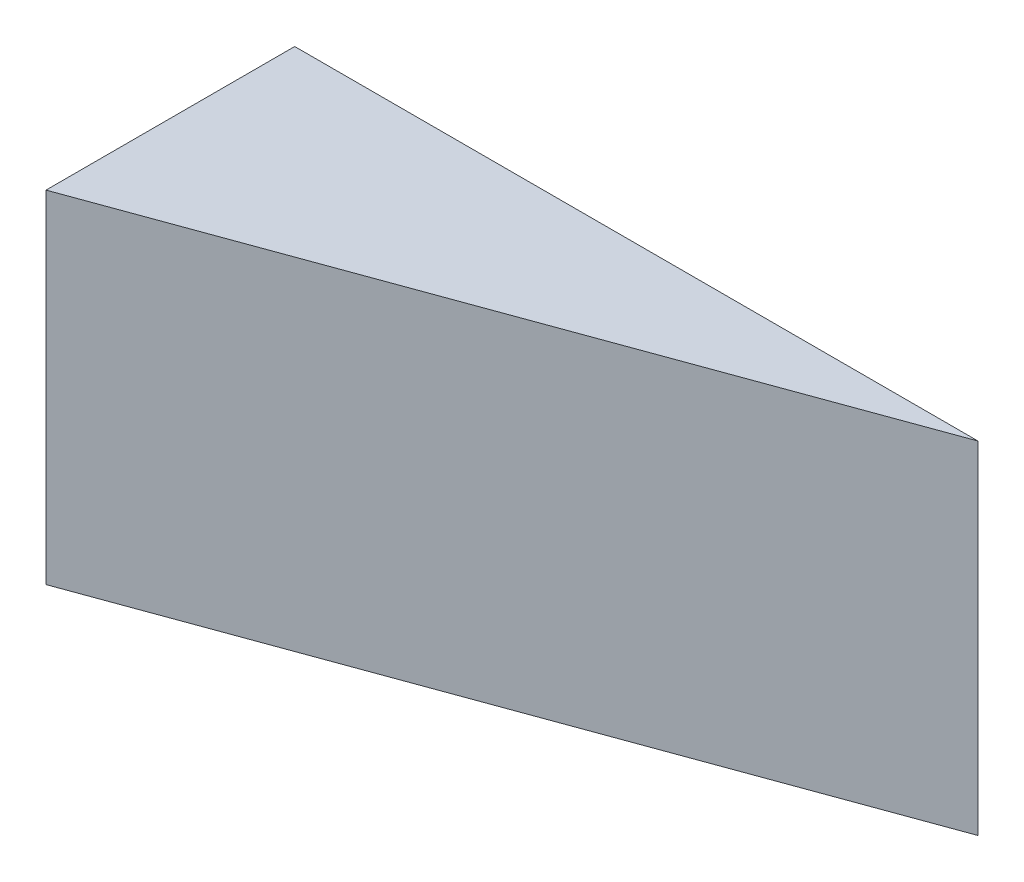
ISO-10303-21;
HEADER;
FILE_DESCRIPTION(('STEP AP214'),'2;1');
FILE_NAME('part.step','',(''),(''),'','','');
FILE_SCHEMA(('AUTOMOTIVE_DESIGN { 1 0 10303 214 1 1 1 1 }'));
ENDSEC;
DATA;
#1=APPLICATION_CONTEXT('core data for automotive mechanical design processes');
#2=APPLICATION_PROTOCOL_DEFINITION('international standard','automotive_design',2000,#1);
#3=PRODUCT_CONTEXT('',#1,'mechanical');
#4=PRODUCT('Part','Part','',(#3));
#5=PRODUCT_RELATED_PRODUCT_CATEGORY('part','',(#4));
#6=PRODUCT_DEFINITION_FORMATION('','',#4);
#7=PRODUCT_DEFINITION_CONTEXT('part definition',#1,'design');
#8=PRODUCT_DEFINITION('design','',#6,#7);
#9=PRODUCT_DEFINITION_SHAPE('','',#8);
#10=(LENGTH_UNIT() NAMED_UNIT(*) SI_UNIT(.MILLI.,.METRE.));
#11=(NAMED_UNIT(*) PLANE_ANGLE_UNIT() SI_UNIT($,.RADIAN.));
#12=(NAMED_UNIT(*) SI_UNIT($,.STERADIAN.) SOLID_ANGLE_UNIT());
#13=UNCERTAINTY_MEASURE_WITH_UNIT(LENGTH_MEASURE(1.E-05),#10,'distance_accuracy_value','');
#14=(GEOMETRIC_REPRESENTATION_CONTEXT(3) GLOBAL_UNCERTAINTY_ASSIGNED_CONTEXT((#13)) GLOBAL_UNIT_ASSIGNED_CONTEXT((#10,
#11,#12)) REPRESENTATION_CONTEXT('',''));
#15=CARTESIAN_POINT('',(0.,0.,0.));
#16=DIRECTION('',(0.,0.,1.));
#17=DIRECTION('',(1.,0.,0.));
#18=AXIS2_PLACEMENT_3D('',#15,#16,#17);
#19=CARTESIAN_POINT('',(0.,20.,14.5588093706478));
#20=DIRECTION('',(1.,0.,0.));
#21=DIRECTION('',(0.,0.,-1.));
#22=AXIS2_PLACEMENT_3D('',#19,#20,#21);
#23=PLANE('',#22);
#24=DIRECTION('',(0.,0.,1.));
#25=VECTOR('',#24,1.);
#26=CARTESIAN_POINT('',(0.,0.,14.5588093706478));
#27=LINE('',#26,#25);
#28=CARTESIAN_POINT('',(0.,0.,0.));
#29=VERTEX_POINT('',#28);
#30=CARTESIAN_POINT('',(0.,0.,14.5588093706478));
#31=VERTEX_POINT('',#30);
#32=EDGE_CURVE('E89',#29,#31,#27,.T.);
#33=ORIENTED_EDGE('',*,*,#32,.T.);
#34=DIRECTION('',(0.,-1.,0.));
#35=VECTOR('',#34,1.);
#36=CARTESIAN_POINT('',(0.,20.,14.5588093706478));
#37=LINE('',#36,#35);
#38=CARTESIAN_POINT('',(0.,20.,14.5588093706478));
#39=VERTEX_POINT('',#38);
#40=EDGE_CURVE('E11',#39,#31,#37,.T.);
#41=ORIENTED_EDGE('',*,*,#40,.F.);
#42=DIRECTION('',(0.,0.,1.));
#43=VECTOR('',#42,1.);
#44=CARTESIAN_POINT('',(0.,20.,14.5588093706478));
#45=LINE('',#44,#43);
#46=CARTESIAN_POINT('',(0.,20.,0.));
#47=VERTEX_POINT('',#46);
#48=EDGE_CURVE('E81',#47,#39,#45,.T.);
#49=ORIENTED_EDGE('',*,*,#48,.F.);
#50=DIRECTION('',(0.,-1.,0.));
#51=VECTOR('',#50,1.);
#52=CARTESIAN_POINT('',(0.,20.,0.));
#53=LINE('',#52,#51);
#54=EDGE_CURVE('E90',#47,#29,#53,.T.);
#55=ORIENTED_EDGE('',*,*,#54,.T.);
#56=EDGE_LOOP('',(#33,#41,#49,#55));
#57=FACE_BOUND('',#56,.T.);
#58=ADVANCED_FACE('F39',(#57),#23,.F.);
#59=CARTESIAN_POINT('',(40.,20.,0.));
#60=DIRECTION('',(-0.342020143325663,0.,-0.93969262078591));
#61=DIRECTION('',(-0.93969262078591,0.,0.342020143325663));
#62=AXIS2_PLACEMENT_3D('',#59,#60,#61);
#63=PLANE('',#62);
#64=DIRECTION('',(0.93969262078591,0.,-0.342020143325663));
#65=VECTOR('',#64,1.);
#66=CARTESIAN_POINT('',(40.,0.,0.));
#67=LINE('',#66,#65);
#68=CARTESIAN_POINT('',(40.,0.,0.));
#69=VERTEX_POINT('',#68);
#70=EDGE_CURVE('E68',#31,#69,#67,.T.);
#71=ORIENTED_EDGE('',*,*,#70,.T.);
#72=DIRECTION('',(0.,-1.,0.));
#73=VECTOR('',#72,1.);
#74=CARTESIAN_POINT('',(40.,20.,0.));
#75=LINE('',#74,#73);
#76=CARTESIAN_POINT('',(40.,20.,0.));
#77=VERTEX_POINT('',#76);
#78=EDGE_CURVE('E48',#77,#69,#75,.T.);
#79=ORIENTED_EDGE('',*,*,#78,.F.);
#80=DIRECTION('',(0.93969262078591,0.,-0.342020143325663));
#81=VECTOR('',#80,1.);
#82=CARTESIAN_POINT('',(40.,20.,0.));
#83=LINE('',#82,#81);
#84=EDGE_CURVE('E76',#39,#77,#83,.T.);
#85=ORIENTED_EDGE('',*,*,#84,.F.);
#86=ORIENTED_EDGE('',*,*,#40,.T.);
#87=EDGE_LOOP('',(#71,#79,#85,#86));
#88=FACE_BOUND('',#87,.T.);
#89=ADVANCED_FACE('F77',(#88),#63,.F.);
#90=CARTESIAN_POINT('',(0.,20.,0.));
#91=DIRECTION('',(0.,0.,1.));
#92=DIRECTION('',(1.,0.,0.));
#93=AXIS2_PLACEMENT_3D('',#90,#91,#92);
#94=PLANE('',#93);
#95=DIRECTION('',(-1.,0.,0.));
#96=VECTOR('',#95,1.);
#97=CARTESIAN_POINT('',(0.,0.,0.));
#98=LINE('',#97,#96);
#99=EDGE_CURVE('E73',#69,#29,#98,.T.);
#100=ORIENTED_EDGE('',*,*,#99,.T.);
#101=ORIENTED_EDGE('',*,*,#54,.F.);
#102=DIRECTION('',(-1.,0.,0.));
#103=VECTOR('',#102,1.);
#104=CARTESIAN_POINT('',(0.,20.,0.));
#105=LINE('',#104,#103);
#106=EDGE_CURVE('E56',#77,#47,#105,.T.);
#107=ORIENTED_EDGE('',*,*,#106,.F.);
#108=ORIENTED_EDGE('',*,*,#78,.T.);
#109=EDGE_LOOP('',(#100,#101,#107,#108));
#110=FACE_BOUND('',#109,.T.);
#111=ADVANCED_FACE('F102',(#110),#94,.F.);
#112=CARTESIAN_POINT('',(0.,20.,0.));
#113=DIRECTION('',(0.,-1.,0.));
#114=DIRECTION('',(0.,0.,-1.));
#115=AXIS2_PLACEMENT_3D('',#112,#113,#114);
#116=PLANE('',#115);
#117=ORIENTED_EDGE('',*,*,#48,.T.);
#118=ORIENTED_EDGE('',*,*,#84,.T.);
#119=ORIENTED_EDGE('',*,*,#106,.T.);
#120=EDGE_LOOP('',(#117,#118,#119));
#121=FACE_BOUND('',#120,.T.);
#122=ADVANCED_FACE('F84',(#121),#116,.F.);
#123=CARTESIAN_POINT('',(0.,0.,0.));
#124=DIRECTION('',(0.,-1.,0.));
#125=DIRECTION('',(0.,0.,-1.));
#126=AXIS2_PLACEMENT_3D('',#123,#124,#125);
#127=PLANE('',#126);
#128=ORIENTED_EDGE('',*,*,#32,.F.);
#129=ORIENTED_EDGE('',*,*,#99,.F.);
#130=ORIENTED_EDGE('',*,*,#70,.F.);
#131=EDGE_LOOP('',(#128,#129,#130));
#132=FACE_BOUND('',#131,.T.);
#133=ADVANCED_FACE('F103',(#132),#127,.T.);
#134=CLOSED_SHELL('',(#58,#89,#111,#122,#133));
#135=MANIFOLD_SOLID_BREP('B2',#134);
#136=ADVANCED_BREP_SHAPE_REPRESENTATION('',(#18,#135),#14);
#137=SHAPE_DEFINITION_REPRESENTATION(#9,#136);
ENDSEC;
END-ISO-10303-21;
